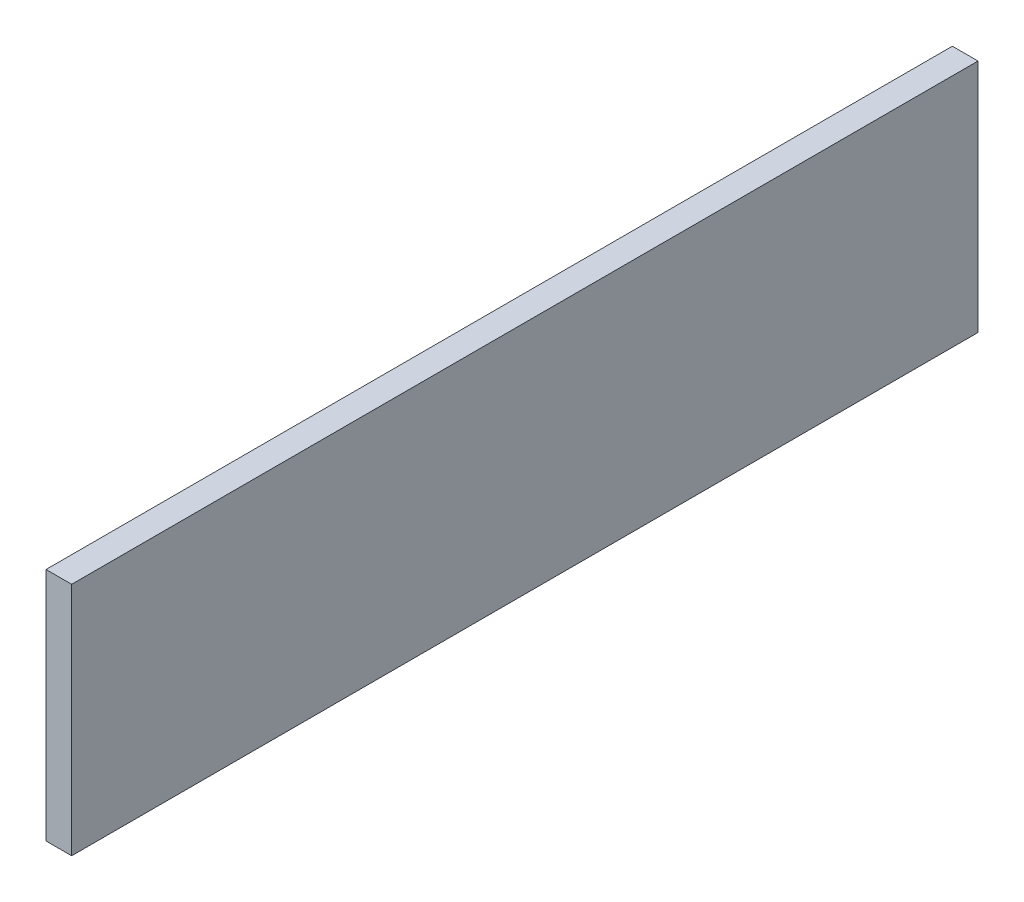
ISO-10303-21;
HEADER;
FILE_DESCRIPTION(('STEP AP214'),'2;1');
FILE_NAME('part.step','',(''),(''),'','','');
FILE_SCHEMA(('AUTOMOTIVE_DESIGN { 1 0 10303 214 1 1 1 1 }'));
ENDSEC;
DATA;
#1=APPLICATION_CONTEXT('core data for automotive mechanical design processes');
#2=APPLICATION_PROTOCOL_DEFINITION('international standard','automotive_design',2000,#1);
#3=PRODUCT_CONTEXT('',#1,'mechanical');
#4=PRODUCT('Part','Part','',(#3));
#5=PRODUCT_RELATED_PRODUCT_CATEGORY('part','',(#4));
#6=PRODUCT_DEFINITION_FORMATION('','',#4);
#7=PRODUCT_DEFINITION_CONTEXT('part definition',#1,'design');
#8=PRODUCT_DEFINITION('design','',#6,#7);
#9=PRODUCT_DEFINITION_SHAPE('','',#8);
#10=(LENGTH_UNIT() NAMED_UNIT(*) SI_UNIT(.MILLI.,.METRE.));
#11=(NAMED_UNIT(*) PLANE_ANGLE_UNIT() SI_UNIT($,.RADIAN.));
#12=(NAMED_UNIT(*) SI_UNIT($,.STERADIAN.) SOLID_ANGLE_UNIT());
#13=UNCERTAINTY_MEASURE_WITH_UNIT(LENGTH_MEASURE(1.E-05),#10,'distance_accuracy_value','');
#14=(GEOMETRIC_REPRESENTATION_CONTEXT(3) GLOBAL_UNCERTAINTY_ASSIGNED_CONTEXT((#13)) GLOBAL_UNIT_ASSIGNED_CONTEXT((#10,
#11,#12)) REPRESENTATION_CONTEXT('',''));
#15=CARTESIAN_POINT('',(0.,0.,0.));
#16=DIRECTION('',(0.,0.,1.));
#17=DIRECTION('',(1.,0.,0.));
#18=AXIS2_PLACEMENT_3D('',#15,#16,#17);
#19=CARTESIAN_POINT('',(12.,55.,-212.));
#20=DIRECTION('',(0.,0.,1.));
#21=DIRECTION('',(1.,0.,0.));
#22=AXIS2_PLACEMENT_3D('',#19,#20,#21);
#23=PLANE('',#22);
#24=DIRECTION('',(0.,1.,0.));
#25=VECTOR('',#24,1.);
#26=CARTESIAN_POINT('',(0.,55.,-212.));
#27=LINE('',#26,#25);
#28=CARTESIAN_POINT('',(0.,-55.,-212.));
#29=VERTEX_POINT('',#28);
#30=CARTESIAN_POINT('',(0.,55.,-212.));
#31=VERTEX_POINT('',#30);
#32=EDGE_CURVE('E95',#29,#31,#27,.T.);
#33=ORIENTED_EDGE('',*,*,#32,.T.);
#34=DIRECTION('',(-1.,0.,0.));
#35=VECTOR('',#34,1.);
#36=CARTESIAN_POINT('',(12.,55.,-212.));
#37=LINE('',#36,#35);
#38=CARTESIAN_POINT('',(12.,55.,-212.));
#39=VERTEX_POINT('',#38);
#40=EDGE_CURVE('E11',#39,#31,#37,.T.);
#41=ORIENTED_EDGE('',*,*,#40,.F.);
#42=DIRECTION('',(0.,1.,0.));
#43=VECTOR('',#42,1.);
#44=CARTESIAN_POINT('',(12.,55.,-212.));
#45=LINE('',#44,#43);
#46=CARTESIAN_POINT('',(12.,-55.,-212.));
#47=VERTEX_POINT('',#46);
#48=EDGE_CURVE('E83',#47,#39,#45,.T.);
#49=ORIENTED_EDGE('',*,*,#48,.F.);
#50=DIRECTION('',(-1.,0.,0.));
#51=VECTOR('',#50,1.);
#52=CARTESIAN_POINT('',(12.,-55.,-212.));
#53=LINE('',#52,#51);
#54=EDGE_CURVE('E91',#47,#29,#53,.T.);
#55=ORIENTED_EDGE('',*,*,#54,.T.);
#56=EDGE_LOOP('',(#33,#41,#49,#55));
#57=FACE_BOUND('',#56,.T.);
#58=ADVANCED_FACE('F32',(#57),#23,.F.);
#59=CARTESIAN_POINT('',(12.,55.,212.));
#60=DIRECTION('',(0.,-1.,0.));
#61=DIRECTION('',(0.,0.,-1.));
#62=AXIS2_PLACEMENT_3D('',#59,#60,#61);
#63=PLANE('',#62);
#64=DIRECTION('',(0.,0.,1.));
#65=VECTOR('',#64,1.);
#66=CARTESIAN_POINT('',(0.,55.,212.));
#67=LINE('',#66,#65);
#68=CARTESIAN_POINT('',(0.,55.,212.));
#69=VERTEX_POINT('',#68);
#70=EDGE_CURVE('E87',#31,#69,#67,.T.);
#71=ORIENTED_EDGE('',*,*,#70,.T.);
#72=DIRECTION('',(-1.,0.,0.));
#73=VECTOR('',#72,1.);
#74=CARTESIAN_POINT('',(12.,55.,212.));
#75=LINE('',#74,#73);
#76=CARTESIAN_POINT('',(12.,55.,212.));
#77=VERTEX_POINT('',#76);
#78=EDGE_CURVE('E40',#77,#69,#75,.T.);
#79=ORIENTED_EDGE('',*,*,#78,.F.);
#80=DIRECTION('',(0.,0.,1.));
#81=VECTOR('',#80,1.);
#82=CARTESIAN_POINT('',(12.,55.,212.));
#83=LINE('',#82,#81);
#84=EDGE_CURVE('E78',#39,#77,#83,.T.);
#85=ORIENTED_EDGE('',*,*,#84,.F.);
#86=ORIENTED_EDGE('',*,*,#40,.T.);
#87=EDGE_LOOP('',(#71,#79,#85,#86));
#88=FACE_BOUND('',#87,.T.);
#89=ADVANCED_FACE('F86',(#88),#63,.F.);
#90=CARTESIAN_POINT('',(12.,55.,212.));
#91=DIRECTION('',(0.,0.,-1.));
#92=DIRECTION('',(0.,1.,0.));
#93=AXIS2_PLACEMENT_3D('',#90,#91,#92);
#94=PLANE('',#93);
#95=DIRECTION('',(0.,-1.,0.));
#96=VECTOR('',#95,1.);
#97=CARTESIAN_POINT('',(0.,55.,212.));
#98=LINE('',#97,#96);
#99=CARTESIAN_POINT('',(0.,-55.,212.));
#100=VERTEX_POINT('',#99);
#101=EDGE_CURVE('E65',#69,#100,#98,.T.);
#102=ORIENTED_EDGE('',*,*,#101,.T.);
#103=DIRECTION('',(-1.,0.,0.));
#104=VECTOR('',#103,1.);
#105=CARTESIAN_POINT('',(12.,-55.,212.));
#106=LINE('',#105,#104);
#107=CARTESIAN_POINT('',(12.,-55.,212.));
#108=VERTEX_POINT('',#107);
#109=EDGE_CURVE('E88',#108,#100,#106,.T.);
#110=ORIENTED_EDGE('',*,*,#109,.F.);
#111=DIRECTION('',(0.,-1.,0.));
#112=VECTOR('',#111,1.);
#113=CARTESIAN_POINT('',(12.,55.,212.));
#114=LINE('',#113,#112);
#115=EDGE_CURVE('E81',#77,#108,#114,.T.);
#116=ORIENTED_EDGE('',*,*,#115,.F.);
#117=ORIENTED_EDGE('',*,*,#78,.T.);
#118=EDGE_LOOP('',(#102,#110,#116,#117));
#119=FACE_BOUND('',#118,.T.);
#120=ADVANCED_FACE('F89',(#119),#94,.F.);
#121=CARTESIAN_POINT('',(12.,-55.,212.));
#122=DIRECTION('',(0.,1.,0.));
#123=DIRECTION('',(0.,0.,1.));
#124=AXIS2_PLACEMENT_3D('',#121,#122,#123);
#125=PLANE('',#124);
#126=DIRECTION('',(0.,0.,-1.));
#127=VECTOR('',#126,1.);
#128=CARTESIAN_POINT('',(0.,-55.,212.));
#129=LINE('',#128,#127);
#130=EDGE_CURVE('E71',#100,#29,#129,.T.);
#131=ORIENTED_EDGE('',*,*,#130,.T.);
#132=ORIENTED_EDGE('',*,*,#54,.F.);
#133=DIRECTION('',(0.,0.,-1.));
#134=VECTOR('',#133,1.);
#135=CARTESIAN_POINT('',(12.,-55.,212.));
#136=LINE('',#135,#134);
#137=EDGE_CURVE('E48',#108,#47,#136,.T.);
#138=ORIENTED_EDGE('',*,*,#137,.F.);
#139=ORIENTED_EDGE('',*,*,#109,.T.);
#140=EDGE_LOOP('',(#131,#132,#138,#139));
#141=FACE_BOUND('',#140,.T.);
#142=ADVANCED_FACE('F102',(#141),#125,.F.);
#143=CARTESIAN_POINT('',(12.,0.,0.));
#144=DIRECTION('',(1.,0.,0.));
#145=DIRECTION('',(0.,0.,-1.));
#146=AXIS2_PLACEMENT_3D('',#143,#144,#145);
#147=PLANE('',#146);
#148=ORIENTED_EDGE('',*,*,#48,.T.);
#149=ORIENTED_EDGE('',*,*,#84,.T.);
#150=ORIENTED_EDGE('',*,*,#115,.T.);
#151=ORIENTED_EDGE('',*,*,#137,.T.);
#152=EDGE_LOOP('',(#148,#149,#150,#151));
#153=FACE_BOUND('',#152,.T.);
#154=ADVANCED_FACE('F79',(#153),#147,.T.);
#155=CARTESIAN_POINT('',(0.,0.,0.));
#156=DIRECTION('',(1.,0.,0.));
#157=DIRECTION('',(0.,0.,-1.));
#158=AXIS2_PLACEMENT_3D('',#155,#156,#157);
#159=PLANE('',#158);
#160=ORIENTED_EDGE('',*,*,#32,.F.);
#161=ORIENTED_EDGE('',*,*,#130,.F.);
#162=ORIENTED_EDGE('',*,*,#101,.F.);
#163=ORIENTED_EDGE('',*,*,#70,.F.);
#164=EDGE_LOOP('',(#160,#161,#162,#163));
#165=FACE_BOUND('',#164,.T.);
#166=ADVANCED_FACE('F105',(#165),#159,.F.);
#167=CLOSED_SHELL('',(#58,#89,#120,#142,#154,#166));
#168=MANIFOLD_SOLID_BREP('B2',#167);
#169=ADVANCED_BREP_SHAPE_REPRESENTATION('',(#18,#168),#14);
#170=SHAPE_DEFINITION_REPRESENTATION(#9,#169);
ENDSEC;
END-ISO-10303-21;
